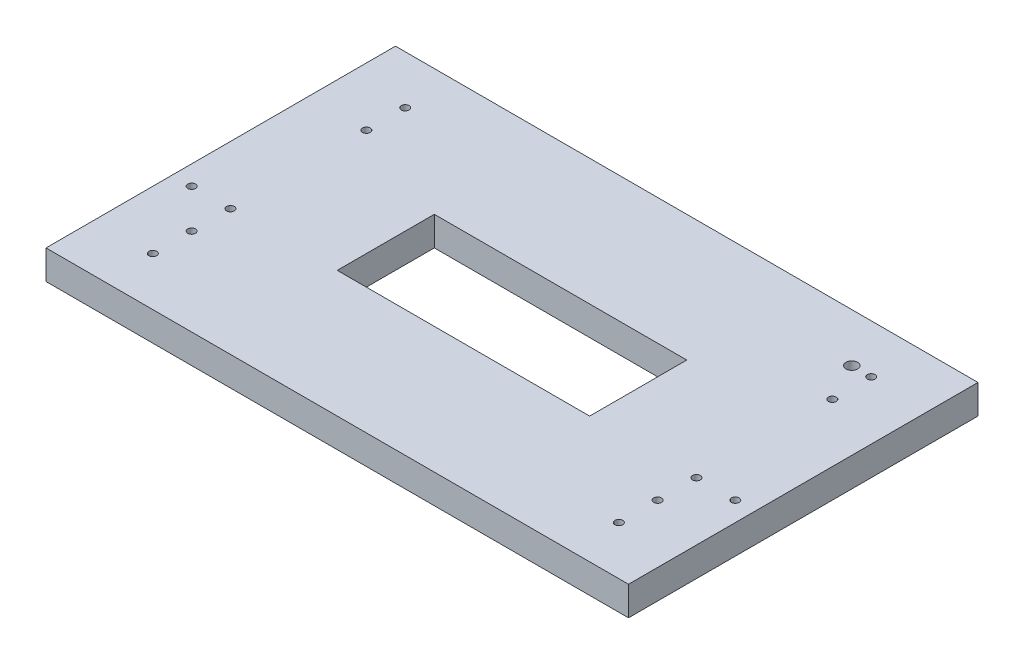
ISO-10303-21;
HEADER;
FILE_DESCRIPTION(('STEP AP214'),'2;1');
FILE_NAME('part.step','',(''),(''),'','','');
FILE_SCHEMA(('AUTOMOTIVE_DESIGN { 1 0 10303 214 1 1 1 1 }'));
ENDSEC;
DATA;
#1=APPLICATION_CONTEXT('core data for automotive mechanical design processes');
#2=APPLICATION_PROTOCOL_DEFINITION('international standard','automotive_design',2000,#1);
#3=PRODUCT_CONTEXT('',#1,'mechanical');
#4=PRODUCT('Part','Part','',(#3));
#5=PRODUCT_RELATED_PRODUCT_CATEGORY('part','',(#4));
#6=PRODUCT_DEFINITION_FORMATION('','',#4);
#7=PRODUCT_DEFINITION_CONTEXT('part definition',#1,'design');
#8=PRODUCT_DEFINITION('design','',#6,#7);
#9=PRODUCT_DEFINITION_SHAPE('','',#8);
#10=(LENGTH_UNIT() NAMED_UNIT(*) SI_UNIT(.MILLI.,.METRE.));
#11=(NAMED_UNIT(*) PLANE_ANGLE_UNIT() SI_UNIT($,.RADIAN.));
#12=(NAMED_UNIT(*) SI_UNIT($,.STERADIAN.) SOLID_ANGLE_UNIT());
#13=UNCERTAINTY_MEASURE_WITH_UNIT(LENGTH_MEASURE(1.E-05),#10,'distance_accuracy_value','');
#14=(GEOMETRIC_REPRESENTATION_CONTEXT(3) GLOBAL_UNCERTAINTY_ASSIGNED_CONTEXT((#13)) GLOBAL_UNIT_ASSIGNED_CONTEXT((#10,
#11,#12)) REPRESENTATION_CONTEXT('',''));
#15=CARTESIAN_POINT('',(0.,0.,0.));
#16=DIRECTION('',(0.,0.,1.));
#17=DIRECTION('',(1.,0.,0.));
#18=AXIS2_PLACEMENT_3D('',#15,#16,#17);
#19=CARTESIAN_POINT('',(150.,15.,90.));
#20=DIRECTION('',(-1.,0.,0.));
#21=DIRECTION('',(0.,0.,1.));
#22=AXIS2_PLACEMENT_3D('',#19,#20,#21);
#23=PLANE('',#22);
#24=DIRECTION('',(0.,0.,-1.));
#25=VECTOR('',#24,1.);
#26=CARTESIAN_POINT('',(150.,0.,90.));
#27=LINE('',#26,#25);
#28=CARTESIAN_POINT('',(150.,0.,90.));
#29=VERTEX_POINT('',#28);
#30=CARTESIAN_POINT('',(150.,0.,-90.));
#31=VERTEX_POINT('',#30);
#32=EDGE_CURVE('E204',#29,#31,#27,.T.);
#33=ORIENTED_EDGE('',*,*,#32,.T.);
#34=DIRECTION('',(0.,-1.,0.));
#35=VECTOR('',#34,1.);
#36=CARTESIAN_POINT('',(150.,15.,-90.));
#37=LINE('',#36,#35);
#38=CARTESIAN_POINT('',(150.,15.,-90.));
#39=VERTEX_POINT('',#38);
#40=EDGE_CURVE('E11',#39,#31,#37,.T.);
#41=ORIENTED_EDGE('',*,*,#40,.F.);
#42=DIRECTION('',(0.,0.,-1.));
#43=VECTOR('',#42,1.);
#44=CARTESIAN_POINT('',(150.,15.,90.));
#45=LINE('',#44,#43);
#46=CARTESIAN_POINT('',(150.,15.,90.));
#47=VERTEX_POINT('',#46);
#48=EDGE_CURVE('E207',#47,#39,#45,.T.);
#49=ORIENTED_EDGE('',*,*,#48,.F.);
#50=DIRECTION('',(0.,-1.,0.));
#51=VECTOR('',#50,1.);
#52=CARTESIAN_POINT('',(150.,15.,90.));
#53=LINE('',#52,#51);
#54=EDGE_CURVE('E217',#47,#29,#53,.T.);
#55=ORIENTED_EDGE('',*,*,#54,.T.);
#56=EDGE_LOOP('',(#33,#41,#49,#55));
#57=FACE_BOUND('',#56,.T.);
#58=ADVANCED_FACE('F33',(#57),#23,.F.);
#59=CARTESIAN_POINT('',(-150.,15.,-90.));
#60=DIRECTION('',(0.,0.,1.));
#61=DIRECTION('',(1.,0.,0.));
#62=AXIS2_PLACEMENT_3D('',#59,#60,#61);
#63=PLANE('',#62);
#64=DIRECTION('',(-1.,0.,0.));
#65=VECTOR('',#64,1.);
#66=CARTESIAN_POINT('',(-150.,0.,-90.));
#67=LINE('',#66,#65);
#68=CARTESIAN_POINT('',(-150.,0.,-90.));
#69=VERTEX_POINT('',#68);
#70=EDGE_CURVE('E220',#31,#69,#67,.T.);
#71=ORIENTED_EDGE('',*,*,#70,.T.);
#72=DIRECTION('',(0.,-1.,0.));
#73=VECTOR('',#72,1.);
#74=CARTESIAN_POINT('',(-150.,15.,-90.));
#75=LINE('',#74,#73);
#76=CARTESIAN_POINT('',(-150.,15.,-90.));
#77=VERTEX_POINT('',#76);
#78=EDGE_CURVE('E40',#77,#69,#75,.T.);
#79=ORIENTED_EDGE('',*,*,#78,.F.);
#80=DIRECTION('',(-1.,0.,0.));
#81=VECTOR('',#80,1.);
#82=CARTESIAN_POINT('',(-150.,15.,-90.));
#83=LINE('',#82,#81);
#84=EDGE_CURVE('E210',#39,#77,#83,.T.);
#85=ORIENTED_EDGE('',*,*,#84,.F.);
#86=ORIENTED_EDGE('',*,*,#40,.T.);
#87=EDGE_LOOP('',(#71,#79,#85,#86));
#88=FACE_BOUND('',#87,.T.);
#89=ADVANCED_FACE('F248',(#88),#63,.F.);
#90=CARTESIAN_POINT('',(-150.,15.,90.));
#91=DIRECTION('',(1.,0.,0.));
#92=DIRECTION('',(0.,0.,-1.));
#93=AXIS2_PLACEMENT_3D('',#90,#91,#92);
#94=PLANE('',#93);
#95=DIRECTION('',(0.,0.,1.));
#96=VECTOR('',#95,1.);
#97=CARTESIAN_POINT('',(-150.,0.,90.));
#98=LINE('',#97,#96);
#99=CARTESIAN_POINT('',(-150.,0.,90.));
#100=VERTEX_POINT('',#99);
#101=EDGE_CURVE('E222',#69,#100,#98,.T.);
#102=ORIENTED_EDGE('',*,*,#101,.T.);
#103=DIRECTION('',(0.,-1.,0.));
#104=VECTOR('',#103,1.);
#105=CARTESIAN_POINT('',(-150.,15.,90.));
#106=LINE('',#105,#104);
#107=CARTESIAN_POINT('',(-150.,15.,90.));
#108=VERTEX_POINT('',#107);
#109=EDGE_CURVE('E227',#108,#100,#106,.T.);
#110=ORIENTED_EDGE('',*,*,#109,.F.);
#111=DIRECTION('',(0.,0.,1.));
#112=VECTOR('',#111,1.);
#113=CARTESIAN_POINT('',(-150.,15.,90.));
#114=LINE('',#113,#112);
#115=EDGE_CURVE('E213',#77,#108,#114,.T.);
#116=ORIENTED_EDGE('',*,*,#115,.F.);
#117=ORIENTED_EDGE('',*,*,#78,.T.);
#118=EDGE_LOOP('',(#102,#110,#116,#117));
#119=FACE_BOUND('',#118,.T.);
#120=ADVANCED_FACE('F234',(#119),#94,.F.);
#121=CARTESIAN_POINT('',(-150.,15.,90.));
#122=DIRECTION('',(0.,0.,-1.));
#123=DIRECTION('',(-1.,0.,0.));
#124=AXIS2_PLACEMENT_3D('',#121,#122,#123);
#125=PLANE('',#124);
#126=DIRECTION('',(1.,0.,0.));
#127=VECTOR('',#126,1.);
#128=CARTESIAN_POINT('',(-150.,0.,90.));
#129=LINE('',#128,#127);
#130=EDGE_CURVE('E211',#100,#29,#129,.T.);
#131=ORIENTED_EDGE('',*,*,#130,.T.);
#132=ORIENTED_EDGE('',*,*,#54,.F.);
#133=DIRECTION('',(1.,0.,0.));
#134=VECTOR('',#133,1.);
#135=CARTESIAN_POINT('',(-150.,15.,90.));
#136=LINE('',#135,#134);
#137=EDGE_CURVE('E215',#108,#47,#136,.T.);
#138=ORIENTED_EDGE('',*,*,#137,.F.);
#139=ORIENTED_EDGE('',*,*,#109,.T.);
#140=EDGE_LOOP('',(#131,#132,#138,#139));
#141=FACE_BOUND('',#140,.T.);
#142=ADVANCED_FACE('F241',(#141),#125,.F.);
#143=CARTESIAN_POINT('',(0.,15.,0.));
#144=DIRECTION('',(0.,-1.,0.));
#145=DIRECTION('',(0.,0.,-1.));
#146=AXIS2_PLACEMENT_3D('',#143,#144,#145);
#147=PLANE('',#146);
#148=CARTESIAN_POINT('',(110.,15.,-65.));
#149=DIRECTION('',(0.,1.,0.));
#150=DIRECTION('',(0.,0.,1.));
#151=AXIS2_PLACEMENT_3D('',#148,#149,#150);
#152=CIRCLE('',#151,3.00000000000001);
#153=CARTESIAN_POINT('',(110.,15.,-62.));
#154=VERTEX_POINT('',#153);
#155=EDGE_CURVE('E386',#154,#154,#152,.T.);
#156=ORIENTED_EDGE('',*,*,#155,.F.);
#157=EDGE_LOOP('',(#156));
#158=FACE_BOUND('',#157,.T.);
#159=DIRECTION('',(0.,0.,1.));
#160=VECTOR('',#159,1.);
#161=CARTESIAN_POINT('',(-65.,15.,25.));
#162=LINE('',#161,#160);
#163=CARTESIAN_POINT('',(-65.,15.,-25.));
#164=VERTEX_POINT('',#163);
#165=CARTESIAN_POINT('',(-65.,15.,25.));
#166=VERTEX_POINT('',#165);
#167=EDGE_CURVE('E121',#164,#166,#162,.T.);
#168=ORIENTED_EDGE('',*,*,#167,.F.);
#169=DIRECTION('',(-1.,0.,0.));
#170=VECTOR('',#169,1.);
#171=CARTESIAN_POINT('',(-65.,15.,-25.));
#172=LINE('',#171,#170);
#173=CARTESIAN_POINT('',(65.,15.,-25.));
#174=VERTEX_POINT('',#173);
#175=EDGE_CURVE('E114',#174,#164,#172,.T.);
#176=ORIENTED_EDGE('',*,*,#175,.F.);
#177=DIRECTION('',(0.,0.,-1.));
#178=VECTOR('',#177,1.);
#179=CARTESIAN_POINT('',(65.,15.,25.));
#180=LINE('',#179,#178);
#181=CARTESIAN_POINT('',(65.,15.,25.));
#182=VERTEX_POINT('',#181);
#183=EDGE_CURVE('E125',#182,#174,#180,.T.);
#184=ORIENTED_EDGE('',*,*,#183,.F.);
#185=DIRECTION('',(1.,0.,0.));
#186=VECTOR('',#185,1.);
#187=CARTESIAN_POINT('',(-65.,15.,25.));
#188=LINE('',#187,#186);
#189=EDGE_CURVE('E47',#166,#182,#188,.T.);
#190=ORIENTED_EDGE('',*,*,#189,.F.);
#191=EDGE_LOOP('',(#168,#176,#184,#190));
#192=FACE_BOUND('',#191,.T.);
#193=CARTESIAN_POINT('',(120.,15.,-65.));
#194=DIRECTION('',(0.,1.,0.));
#195=DIRECTION('',(0.,0.,1.));
#196=AXIS2_PLACEMENT_3D('',#193,#194,#195);
#197=CIRCLE('',#196,2.);
#198=CARTESIAN_POINT('',(120.,15.,-63.));
#199=VERTEX_POINT('',#198);
#200=EDGE_CURVE('E134',#199,#199,#197,.T.);
#201=ORIENTED_EDGE('',*,*,#200,.F.);
#202=EDGE_LOOP('',(#201));
#203=FACE_BOUND('',#202,.T.);
#204=CARTESIAN_POINT('',(140.,15.,25.));
#205=DIRECTION('',(0.,1.,0.));
#206=DIRECTION('',(0.,0.,1.));
#207=AXIS2_PLACEMENT_3D('',#204,#205,#206);
#208=CIRCLE('',#207,2.);
#209=CARTESIAN_POINT('',(140.,15.,27.));
#210=VERTEX_POINT('',#209);
#211=EDGE_CURVE('E138',#210,#210,#208,.T.);
#212=ORIENTED_EDGE('',*,*,#211,.F.);
#213=EDGE_LOOP('',(#212));
#214=FACE_BOUND('',#213,.T.);
#215=CARTESIAN_POINT('',(120.,15.,25.));
#216=DIRECTION('',(0.,1.,0.));
#217=DIRECTION('',(0.,0.,1.));
#218=AXIS2_PLACEMENT_3D('',#215,#216,#217);
#219=CIRCLE('',#218,2.);
#220=CARTESIAN_POINT('',(120.,15.,27.));
#221=VERTEX_POINT('',#220);
#222=EDGE_CURVE('E144',#221,#221,#219,.T.);
#223=ORIENTED_EDGE('',*,*,#222,.F.);
#224=EDGE_LOOP('',(#223));
#225=FACE_BOUND('',#224,.T.);
#226=CARTESIAN_POINT('',(-120.,15.,25.));
#227=DIRECTION('',(0.,1.,0.));
#228=DIRECTION('',(0.,0.,1.));
#229=AXIS2_PLACEMENT_3D('',#226,#227,#228);
#230=CIRCLE('',#229,2.);
#231=CARTESIAN_POINT('',(-120.,15.,27.));
#232=VERTEX_POINT('',#231);
#233=EDGE_CURVE('E150',#232,#232,#230,.T.);
#234=ORIENTED_EDGE('',*,*,#233,.F.);
#235=EDGE_LOOP('',(#234));
#236=FACE_BOUND('',#235,.T.);
#237=CARTESIAN_POINT('',(-140.,15.,25.));
#238=DIRECTION('',(0.,1.,0.));
#239=DIRECTION('',(0.,0.,1.));
#240=AXIS2_PLACEMENT_3D('',#237,#238,#239);
#241=CIRCLE('',#240,2.);
#242=CARTESIAN_POINT('',(-140.,15.,27.));
#243=VERTEX_POINT('',#242);
#244=EDGE_CURVE('E156',#243,#243,#241,.T.);
#245=ORIENTED_EDGE('',*,*,#244,.F.);
#246=EDGE_LOOP('',(#245));
#247=FACE_BOUND('',#246,.T.);
#248=CARTESIAN_POINT('',(120.,15.,-45.));
#249=DIRECTION('',(0.,1.,0.));
#250=DIRECTION('',(0.,0.,1.));
#251=AXIS2_PLACEMENT_3D('',#248,#249,#250);
#252=CIRCLE('',#251,2.);
#253=CARTESIAN_POINT('',(120.,15.,-43.));
#254=VERTEX_POINT('',#253);
#255=EDGE_CURVE('E162',#254,#254,#252,.T.);
#256=ORIENTED_EDGE('',*,*,#255,.F.);
#257=EDGE_LOOP('',(#256));
#258=FACE_BOUND('',#257,.T.);
#259=CARTESIAN_POINT('',(-120.,15.,-45.));
#260=DIRECTION('',(0.,1.,0.));
#261=DIRECTION('',(0.,0.,1.));
#262=AXIS2_PLACEMENT_3D('',#259,#260,#261);
#263=CIRCLE('',#262,2.00000000000001);
#264=CARTESIAN_POINT('',(-120.,15.,-43.));
#265=VERTEX_POINT('',#264);
#266=EDGE_CURVE('E168',#265,#265,#263,.T.);
#267=ORIENTED_EDGE('',*,*,#266,.F.);
#268=EDGE_LOOP('',(#267));
#269=FACE_BOUND('',#268,.T.);
#270=CARTESIAN_POINT('',(-120.,15.,-65.));
#271=DIRECTION('',(0.,1.,0.));
#272=DIRECTION('',(0.,0.,1.));
#273=AXIS2_PLACEMENT_3D('',#270,#271,#272);
#274=CIRCLE('',#273,2.);
#275=CARTESIAN_POINT('',(-120.,15.,-63.));
#276=VERTEX_POINT('',#275);
#277=EDGE_CURVE('E174',#276,#276,#274,.T.);
#278=ORIENTED_EDGE('',*,*,#277,.F.);
#279=EDGE_LOOP('',(#278));
#280=FACE_BOUND('',#279,.T.);
#281=CARTESIAN_POINT('',(120.,15.,65.));
#282=DIRECTION('',(0.,1.,0.));
#283=DIRECTION('',(0.,0.,1.));
#284=AXIS2_PLACEMENT_3D('',#281,#282,#283);
#285=CIRCLE('',#284,2.);
#286=CARTESIAN_POINT('',(120.,15.,67.));
#287=VERTEX_POINT('',#286);
#288=EDGE_CURVE('E180',#287,#287,#285,.T.);
#289=ORIENTED_EDGE('',*,*,#288,.F.);
#290=EDGE_LOOP('',(#289));
#291=FACE_BOUND('',#290,.T.);
#292=CARTESIAN_POINT('',(120.,15.,45.));
#293=DIRECTION('',(0.,1.,0.));
#294=DIRECTION('',(0.,0.,1.));
#295=AXIS2_PLACEMENT_3D('',#292,#293,#294);
#296=CIRCLE('',#295,2.);
#297=CARTESIAN_POINT('',(120.,15.,47.));
#298=VERTEX_POINT('',#297);
#299=EDGE_CURVE('E186',#298,#298,#296,.T.);
#300=ORIENTED_EDGE('',*,*,#299,.F.);
#301=EDGE_LOOP('',(#300));
#302=FACE_BOUND('',#301,.T.);
#303=CARTESIAN_POINT('',(-120.,15.,65.));
#304=DIRECTION('',(0.,1.,0.));
#305=DIRECTION('',(0.,0.,1.));
#306=AXIS2_PLACEMENT_3D('',#303,#304,#305);
#307=CIRCLE('',#306,2.);
#308=CARTESIAN_POINT('',(-120.,15.,67.));
#309=VERTEX_POINT('',#308);
#310=EDGE_CURVE('E192',#309,#309,#307,.T.);
#311=ORIENTED_EDGE('',*,*,#310,.F.);
#312=EDGE_LOOP('',(#311));
#313=FACE_BOUND('',#312,.T.);
#314=CARTESIAN_POINT('',(-120.,15.,45.));
#315=DIRECTION('',(0.,1.,0.));
#316=DIRECTION('',(0.,0.,1.));
#317=AXIS2_PLACEMENT_3D('',#314,#315,#316);
#318=CIRCLE('',#317,2.);
#319=CARTESIAN_POINT('',(-120.,15.,47.));
#320=VERTEX_POINT('',#319);
#321=EDGE_CURVE('E198',#320,#320,#318,.T.);
#322=ORIENTED_EDGE('',*,*,#321,.F.);
#323=EDGE_LOOP('',(#322));
#324=FACE_BOUND('',#323,.T.);
#325=ORIENTED_EDGE('',*,*,#48,.T.);
#326=ORIENTED_EDGE('',*,*,#84,.T.);
#327=ORIENTED_EDGE('',*,*,#115,.T.);
#328=ORIENTED_EDGE('',*,*,#137,.T.);
#329=EDGE_LOOP('',(#325,#326,#327,#328));
#330=FACE_BOUND('',#329,.T.);
#331=ADVANCED_FACE('F247',(#158,#192,#203,#214,#225,#236,#247,#258,#269,#280,#291,#302,#313,
#324,#330),#147,.F.);
#332=CARTESIAN_POINT('',(0.,0.,0.));
#333=DIRECTION('',(0.,-1.,0.));
#334=DIRECTION('',(0.,0.,-1.));
#335=AXIS2_PLACEMENT_3D('',#332,#333,#334);
#336=PLANE('',#335);
#337=CARTESIAN_POINT('',(140.,0.,-65.));
#338=DIRECTION('',(0.,-1.,0.));
#339=DIRECTION('',(0.,0.,-1.));
#340=AXIS2_PLACEMENT_3D('',#337,#338,#339);
#341=CIRCLE('',#340,2.);
#342=CARTESIAN_POINT('',(140.,0.,-67.));
#343=VERTEX_POINT('',#342);
#344=EDGE_CURVE('E387',#343,#343,#341,.T.);
#345=ORIENTED_EDGE('',*,*,#344,.F.);
#346=EDGE_LOOP('',(#345));
#347=FACE_BOUND('',#346,.T.);
#348=CARTESIAN_POINT('',(110.,0.,-65.));
#349=DIRECTION('',(0.,-1.,0.));
#350=DIRECTION('',(0.,0.,-1.));
#351=AXIS2_PLACEMENT_3D('',#348,#349,#350);
#352=CIRCLE('',#351,3.00000000000001);
#353=CARTESIAN_POINT('',(110.,0.,-68.));
#354=VERTEX_POINT('',#353);
#355=EDGE_CURVE('E390',#354,#354,#352,.F.);
#356=ORIENTED_EDGE('',*,*,#355,.T.);
#357=EDGE_LOOP('',(#356));
#358=FACE_BOUND('',#357,.T.);
#359=DIRECTION('',(-1.,0.,0.));
#360=VECTOR('',#359,1.);
#361=CARTESIAN_POINT('',(-65.,0.,-25.));
#362=LINE('',#361,#360);
#363=CARTESIAN_POINT('',(65.,0.,-25.));
#364=VERTEX_POINT('',#363);
#365=CARTESIAN_POINT('',(-65.,0.,-25.));
#366=VERTEX_POINT('',#365);
#367=EDGE_CURVE('E111',#364,#366,#362,.T.);
#368=ORIENTED_EDGE('',*,*,#367,.T.);
#369=DIRECTION('',(0.,0.,1.));
#370=VECTOR('',#369,1.);
#371=CARTESIAN_POINT('',(-65.,0.,25.));
#372=LINE('',#371,#370);
#373=CARTESIAN_POINT('',(-65.,0.,25.));
#374=VERTEX_POINT('',#373);
#375=EDGE_CURVE('E98',#366,#374,#372,.T.);
#376=ORIENTED_EDGE('',*,*,#375,.T.);
#377=DIRECTION('',(1.,0.,0.));
#378=VECTOR('',#377,1.);
#379=CARTESIAN_POINT('',(-65.,0.,25.));
#380=LINE('',#379,#378);
#381=CARTESIAN_POINT('',(65.,0.,25.));
#382=VERTEX_POINT('',#381);
#383=EDGE_CURVE('E129',#374,#382,#380,.T.);
#384=ORIENTED_EDGE('',*,*,#383,.T.);
#385=DIRECTION('',(0.,0.,-1.));
#386=VECTOR('',#385,1.);
#387=CARTESIAN_POINT('',(65.,0.,25.));
#388=LINE('',#387,#386);
#389=EDGE_CURVE('E119',#382,#364,#388,.T.);
#390=ORIENTED_EDGE('',*,*,#389,.T.);
#391=EDGE_LOOP('',(#368,#376,#384,#390));
#392=FACE_BOUND('',#391,.T.);
#393=ORIENTED_EDGE('',*,*,#32,.F.);
#394=ORIENTED_EDGE('',*,*,#130,.F.);
#395=ORIENTED_EDGE('',*,*,#101,.F.);
#396=ORIENTED_EDGE('',*,*,#70,.F.);
#397=EDGE_LOOP('',(#393,#394,#395,#396));
#398=FACE_BOUND('',#397,.T.);
#399=ADVANCED_FACE('F117',(#347,#358,#392,#398),#336,.T.);
#400=CARTESIAN_POINT('',(-120.,5.,45.));
#401=DIRECTION('',(0.,1.,0.));
#402=DIRECTION('',(0.,0.,1.));
#403=AXIS2_PLACEMENT_3D('',#400,#401,#402);
#404=CYLINDRICAL_SURFACE('',#403,2.);
#405=CARTESIAN_POINT('',(-120.,5.,45.));
#406=DIRECTION('',(0.,1.,0.));
#407=DIRECTION('',(0.,0.,1.));
#408=AXIS2_PLACEMENT_3D('',#405,#406,#407);
#409=CIRCLE('',#408,2.);
#410=CARTESIAN_POINT('',(-120.,5.,47.));
#411=VERTEX_POINT('',#410);
#412=EDGE_CURVE('E201',#411,#411,#409,.T.);
#413=ORIENTED_EDGE('',*,*,#412,.F.);
#414=EDGE_LOOP('',(#413));
#415=FACE_BOUND('',#414,.T.);
#416=ORIENTED_EDGE('',*,*,#321,.T.);
#417=EDGE_LOOP('',(#416));
#418=FACE_BOUND('',#417,.T.);
#419=ADVANCED_FACE('F260',(#415,#418),#404,.F.);
#420=CARTESIAN_POINT('',(-120.,5.,45.));
#421=DIRECTION('',(0.,1.,0.));
#422=DIRECTION('',(0.,0.,1.));
#423=AXIS2_PLACEMENT_3D('',#420,#421,#422);
#424=PLANE('',#423);
#425=ORIENTED_EDGE('',*,*,#412,.T.);
#426=EDGE_LOOP('',(#425));
#427=FACE_BOUND('',#426,.T.);
#428=ADVANCED_FACE('F267',(#427),#424,.T.);
#429=CARTESIAN_POINT('',(-120.,5.,65.));
#430=DIRECTION('',(0.,1.,0.));
#431=DIRECTION('',(0.,0.,1.));
#432=AXIS2_PLACEMENT_3D('',#429,#430,#431);
#433=CYLINDRICAL_SURFACE('',#432,2.);
#434=CARTESIAN_POINT('',(-120.,5.,65.));
#435=DIRECTION('',(0.,1.,0.));
#436=DIRECTION('',(0.,0.,1.));
#437=AXIS2_PLACEMENT_3D('',#434,#435,#436);
#438=CIRCLE('',#437,2.);
#439=CARTESIAN_POINT('',(-120.,5.,67.));
#440=VERTEX_POINT('',#439);
#441=EDGE_CURVE('E195',#440,#440,#438,.T.);
#442=ORIENTED_EDGE('',*,*,#441,.F.);
#443=EDGE_LOOP('',(#442));
#444=FACE_BOUND('',#443,.T.);
#445=ORIENTED_EDGE('',*,*,#310,.T.);
#446=EDGE_LOOP('',(#445));
#447=FACE_BOUND('',#446,.T.);
#448=ADVANCED_FACE('F271',(#444,#447),#433,.F.);
#449=CARTESIAN_POINT('',(-120.,5.,65.));
#450=DIRECTION('',(0.,1.,0.));
#451=DIRECTION('',(0.,0.,1.));
#452=AXIS2_PLACEMENT_3D('',#449,#450,#451);
#453=PLANE('',#452);
#454=ORIENTED_EDGE('',*,*,#441,.T.);
#455=EDGE_LOOP('',(#454));
#456=FACE_BOUND('',#455,.T.);
#457=ADVANCED_FACE('F275',(#456),#453,.T.);
#458=CARTESIAN_POINT('',(120.,5.,45.));
#459=DIRECTION('',(0.,1.,0.));
#460=DIRECTION('',(0.,0.,1.));
#461=AXIS2_PLACEMENT_3D('',#458,#459,#460);
#462=CYLINDRICAL_SURFACE('',#461,2.);
#463=CARTESIAN_POINT('',(120.,5.,45.));
#464=DIRECTION('',(0.,1.,0.));
#465=DIRECTION('',(0.,0.,1.));
#466=AXIS2_PLACEMENT_3D('',#463,#464,#465);
#467=CIRCLE('',#466,2.);
#468=CARTESIAN_POINT('',(120.,5.,47.));
#469=VERTEX_POINT('',#468);
#470=EDGE_CURVE('E189',#469,#469,#467,.T.);
#471=ORIENTED_EDGE('',*,*,#470,.F.);
#472=EDGE_LOOP('',(#471));
#473=FACE_BOUND('',#472,.T.);
#474=ORIENTED_EDGE('',*,*,#299,.T.);
#475=EDGE_LOOP('',(#474));
#476=FACE_BOUND('',#475,.T.);
#477=ADVANCED_FACE('F279',(#473,#476),#462,.F.);
#478=CARTESIAN_POINT('',(120.,5.,45.));
#479=DIRECTION('',(0.,1.,0.));
#480=DIRECTION('',(0.,0.,1.));
#481=AXIS2_PLACEMENT_3D('',#478,#479,#480);
#482=PLANE('',#481);
#483=ORIENTED_EDGE('',*,*,#470,.T.);
#484=EDGE_LOOP('',(#483));
#485=FACE_BOUND('',#484,.T.);
#486=ADVANCED_FACE('F283',(#485),#482,.T.);
#487=CARTESIAN_POINT('',(120.,5.,65.));
#488=DIRECTION('',(0.,1.,0.));
#489=DIRECTION('',(0.,0.,1.));
#490=AXIS2_PLACEMENT_3D('',#487,#488,#489);
#491=CYLINDRICAL_SURFACE('',#490,2.);
#492=CARTESIAN_POINT('',(120.,5.,65.));
#493=DIRECTION('',(0.,1.,0.));
#494=DIRECTION('',(0.,0.,1.));
#495=AXIS2_PLACEMENT_3D('',#492,#493,#494);
#496=CIRCLE('',#495,2.);
#497=CARTESIAN_POINT('',(120.,5.,67.));
#498=VERTEX_POINT('',#497);
#499=EDGE_CURVE('E183',#498,#498,#496,.T.);
#500=ORIENTED_EDGE('',*,*,#499,.F.);
#501=EDGE_LOOP('',(#500));
#502=FACE_BOUND('',#501,.T.);
#503=ORIENTED_EDGE('',*,*,#288,.T.);
#504=EDGE_LOOP('',(#503));
#505=FACE_BOUND('',#504,.T.);
#506=ADVANCED_FACE('F287',(#502,#505),#491,.F.);
#507=CARTESIAN_POINT('',(120.,5.,65.));
#508=DIRECTION('',(0.,1.,0.));
#509=DIRECTION('',(0.,0.,1.));
#510=AXIS2_PLACEMENT_3D('',#507,#508,#509);
#511=PLANE('',#510);
#512=ORIENTED_EDGE('',*,*,#499,.T.);
#513=EDGE_LOOP('',(#512));
#514=FACE_BOUND('',#513,.T.);
#515=ADVANCED_FACE('F291',(#514),#511,.T.);
#516=CARTESIAN_POINT('',(-120.,5.,-65.));
#517=DIRECTION('',(0.,1.,0.));
#518=DIRECTION('',(0.,0.,1.));
#519=AXIS2_PLACEMENT_3D('',#516,#517,#518);
#520=CYLINDRICAL_SURFACE('',#519,2.);
#521=CARTESIAN_POINT('',(-120.,5.,-65.));
#522=DIRECTION('',(0.,1.,0.));
#523=DIRECTION('',(0.,0.,1.));
#524=AXIS2_PLACEMENT_3D('',#521,#522,#523);
#525=CIRCLE('',#524,2.);
#526=CARTESIAN_POINT('',(-120.,5.,-63.));
#527=VERTEX_POINT('',#526);
#528=EDGE_CURVE('E177',#527,#527,#525,.T.);
#529=ORIENTED_EDGE('',*,*,#528,.F.);
#530=EDGE_LOOP('',(#529));
#531=FACE_BOUND('',#530,.T.);
#532=ORIENTED_EDGE('',*,*,#277,.T.);
#533=EDGE_LOOP('',(#532));
#534=FACE_BOUND('',#533,.T.);
#535=ADVANCED_FACE('F295',(#531,#534),#520,.F.);
#536=CARTESIAN_POINT('',(-120.,5.,-65.));
#537=DIRECTION('',(0.,1.,0.));
#538=DIRECTION('',(0.,0.,1.));
#539=AXIS2_PLACEMENT_3D('',#536,#537,#538);
#540=PLANE('',#539);
#541=ORIENTED_EDGE('',*,*,#528,.T.);
#542=EDGE_LOOP('',(#541));
#543=FACE_BOUND('',#542,.T.);
#544=ADVANCED_FACE('F299',(#543),#540,.T.);
#545=CARTESIAN_POINT('',(-120.,5.,-45.));
#546=DIRECTION('',(0.,1.,0.));
#547=DIRECTION('',(0.,0.,1.));
#548=AXIS2_PLACEMENT_3D('',#545,#546,#547);
#549=CYLINDRICAL_SURFACE('',#548,2.00000000000001);
#550=CARTESIAN_POINT('',(-120.,5.,-45.));
#551=DIRECTION('',(0.,1.,0.));
#552=DIRECTION('',(0.,0.,1.));
#553=AXIS2_PLACEMENT_3D('',#550,#551,#552);
#554=CIRCLE('',#553,2.00000000000001);
#555=CARTESIAN_POINT('',(-120.,5.,-43.));
#556=VERTEX_POINT('',#555);
#557=EDGE_CURVE('E171',#556,#556,#554,.T.);
#558=ORIENTED_EDGE('',*,*,#557,.F.);
#559=EDGE_LOOP('',(#558));
#560=FACE_BOUND('',#559,.T.);
#561=ORIENTED_EDGE('',*,*,#266,.T.);
#562=EDGE_LOOP('',(#561));
#563=FACE_BOUND('',#562,.T.);
#564=ADVANCED_FACE('F303',(#560,#563),#549,.F.);
#565=CARTESIAN_POINT('',(-120.,5.,-45.));
#566=DIRECTION('',(0.,1.,0.));
#567=DIRECTION('',(0.,0.,1.));
#568=AXIS2_PLACEMENT_3D('',#565,#566,#567);
#569=PLANE('',#568);
#570=ORIENTED_EDGE('',*,*,#557,.T.);
#571=EDGE_LOOP('',(#570));
#572=FACE_BOUND('',#571,.T.);
#573=ADVANCED_FACE('F307',(#572),#569,.T.);
#574=CARTESIAN_POINT('',(120.,5.,-45.));
#575=DIRECTION('',(0.,1.,0.));
#576=DIRECTION('',(0.,0.,1.));
#577=AXIS2_PLACEMENT_3D('',#574,#575,#576);
#578=CYLINDRICAL_SURFACE('',#577,2.);
#579=CARTESIAN_POINT('',(120.,5.,-45.));
#580=DIRECTION('',(0.,1.,0.));
#581=DIRECTION('',(0.,0.,1.));
#582=AXIS2_PLACEMENT_3D('',#579,#580,#581);
#583=CIRCLE('',#582,2.);
#584=CARTESIAN_POINT('',(120.,5.,-43.));
#585=VERTEX_POINT('',#584);
#586=EDGE_CURVE('E165',#585,#585,#583,.T.);
#587=ORIENTED_EDGE('',*,*,#586,.F.);
#588=EDGE_LOOP('',(#587));
#589=FACE_BOUND('',#588,.T.);
#590=ORIENTED_EDGE('',*,*,#255,.T.);
#591=EDGE_LOOP('',(#590));
#592=FACE_BOUND('',#591,.T.);
#593=ADVANCED_FACE('F311',(#589,#592),#578,.F.);
#594=CARTESIAN_POINT('',(120.,5.,-45.));
#595=DIRECTION('',(0.,1.,0.));
#596=DIRECTION('',(0.,0.,1.));
#597=AXIS2_PLACEMENT_3D('',#594,#595,#596);
#598=PLANE('',#597);
#599=ORIENTED_EDGE('',*,*,#586,.T.);
#600=EDGE_LOOP('',(#599));
#601=FACE_BOUND('',#600,.T.);
#602=ADVANCED_FACE('F315',(#601),#598,.T.);
#603=CARTESIAN_POINT('',(-140.,5.,25.));
#604=DIRECTION('',(0.,1.,0.));
#605=DIRECTION('',(0.,0.,1.));
#606=AXIS2_PLACEMENT_3D('',#603,#604,#605);
#607=CYLINDRICAL_SURFACE('',#606,2.);
#608=CARTESIAN_POINT('',(-140.,5.,25.));
#609=DIRECTION('',(0.,1.,0.));
#610=DIRECTION('',(0.,0.,1.));
#611=AXIS2_PLACEMENT_3D('',#608,#609,#610);
#612=CIRCLE('',#611,2.);
#613=CARTESIAN_POINT('',(-140.,5.,27.));
#614=VERTEX_POINT('',#613);
#615=EDGE_CURVE('E159',#614,#614,#612,.T.);
#616=ORIENTED_EDGE('',*,*,#615,.F.);
#617=EDGE_LOOP('',(#616));
#618=FACE_BOUND('',#617,.T.);
#619=ORIENTED_EDGE('',*,*,#244,.T.);
#620=EDGE_LOOP('',(#619));
#621=FACE_BOUND('',#620,.T.);
#622=ADVANCED_FACE('F319',(#618,#621),#607,.F.);
#623=CARTESIAN_POINT('',(-140.,5.,25.));
#624=DIRECTION('',(0.,1.,0.));
#625=DIRECTION('',(0.,0.,1.));
#626=AXIS2_PLACEMENT_3D('',#623,#624,#625);
#627=PLANE('',#626);
#628=ORIENTED_EDGE('',*,*,#615,.T.);
#629=EDGE_LOOP('',(#628));
#630=FACE_BOUND('',#629,.T.);
#631=ADVANCED_FACE('F323',(#630),#627,.T.);
#632=CARTESIAN_POINT('',(-120.,5.,25.));
#633=DIRECTION('',(0.,1.,0.));
#634=DIRECTION('',(0.,0.,1.));
#635=AXIS2_PLACEMENT_3D('',#632,#633,#634);
#636=CYLINDRICAL_SURFACE('',#635,2.);
#637=CARTESIAN_POINT('',(-120.,5.,25.));
#638=DIRECTION('',(0.,1.,0.));
#639=DIRECTION('',(0.,0.,1.));
#640=AXIS2_PLACEMENT_3D('',#637,#638,#639);
#641=CIRCLE('',#640,2.);
#642=CARTESIAN_POINT('',(-120.,5.,27.));
#643=VERTEX_POINT('',#642);
#644=EDGE_CURVE('E153',#643,#643,#641,.T.);
#645=ORIENTED_EDGE('',*,*,#644,.F.);
#646=EDGE_LOOP('',(#645));
#647=FACE_BOUND('',#646,.T.);
#648=ORIENTED_EDGE('',*,*,#233,.T.);
#649=EDGE_LOOP('',(#648));
#650=FACE_BOUND('',#649,.T.);
#651=ADVANCED_FACE('F327',(#647,#650),#636,.F.);
#652=CARTESIAN_POINT('',(-120.,5.,25.));
#653=DIRECTION('',(0.,1.,0.));
#654=DIRECTION('',(0.,0.,1.));
#655=AXIS2_PLACEMENT_3D('',#652,#653,#654);
#656=PLANE('',#655);
#657=ORIENTED_EDGE('',*,*,#644,.T.);
#658=EDGE_LOOP('',(#657));
#659=FACE_BOUND('',#658,.T.);
#660=ADVANCED_FACE('F331',(#659),#656,.T.);
#661=CARTESIAN_POINT('',(120.,5.,25.));
#662=DIRECTION('',(0.,1.,0.));
#663=DIRECTION('',(0.,0.,1.));
#664=AXIS2_PLACEMENT_3D('',#661,#662,#663);
#665=CYLINDRICAL_SURFACE('',#664,2.);
#666=CARTESIAN_POINT('',(120.,5.,25.));
#667=DIRECTION('',(0.,1.,0.));
#668=DIRECTION('',(0.,0.,1.));
#669=AXIS2_PLACEMENT_3D('',#666,#667,#668);
#670=CIRCLE('',#669,2.);
#671=CARTESIAN_POINT('',(120.,5.,27.));
#672=VERTEX_POINT('',#671);
#673=EDGE_CURVE('E147',#672,#672,#670,.T.);
#674=ORIENTED_EDGE('',*,*,#673,.F.);
#675=EDGE_LOOP('',(#674));
#676=FACE_BOUND('',#675,.T.);
#677=ORIENTED_EDGE('',*,*,#222,.T.);
#678=EDGE_LOOP('',(#677));
#679=FACE_BOUND('',#678,.T.);
#680=ADVANCED_FACE('F335',(#676,#679),#665,.F.);
#681=CARTESIAN_POINT('',(120.,5.,25.));
#682=DIRECTION('',(0.,1.,0.));
#683=DIRECTION('',(0.,0.,1.));
#684=AXIS2_PLACEMENT_3D('',#681,#682,#683);
#685=PLANE('',#684);
#686=ORIENTED_EDGE('',*,*,#673,.T.);
#687=EDGE_LOOP('',(#686));
#688=FACE_BOUND('',#687,.T.);
#689=ADVANCED_FACE('F339',(#688),#685,.T.);
#690=CARTESIAN_POINT('',(140.,5.,25.));
#691=DIRECTION('',(0.,1.,0.));
#692=DIRECTION('',(0.,0.,1.));
#693=AXIS2_PLACEMENT_3D('',#690,#691,#692);
#694=CYLINDRICAL_SURFACE('',#693,2.);
#695=CARTESIAN_POINT('',(140.,5.,25.));
#696=DIRECTION('',(0.,1.,0.));
#697=DIRECTION('',(0.,0.,1.));
#698=AXIS2_PLACEMENT_3D('',#695,#696,#697);
#699=CIRCLE('',#698,2.);
#700=CARTESIAN_POINT('',(140.,5.,27.));
#701=VERTEX_POINT('',#700);
#702=EDGE_CURVE('E141',#701,#701,#699,.T.);
#703=ORIENTED_EDGE('',*,*,#702,.F.);
#704=EDGE_LOOP('',(#703));
#705=FACE_BOUND('',#704,.T.);
#706=ORIENTED_EDGE('',*,*,#211,.T.);
#707=EDGE_LOOP('',(#706));
#708=FACE_BOUND('',#707,.T.);
#709=ADVANCED_FACE('F343',(#705,#708),#694,.F.);
#710=CARTESIAN_POINT('',(140.,5.,25.));
#711=DIRECTION('',(0.,1.,0.));
#712=DIRECTION('',(0.,0.,1.));
#713=AXIS2_PLACEMENT_3D('',#710,#711,#712);
#714=PLANE('',#713);
#715=ORIENTED_EDGE('',*,*,#702,.T.);
#716=EDGE_LOOP('',(#715));
#717=FACE_BOUND('',#716,.T.);
#718=ADVANCED_FACE('F347',(#717),#714,.T.);
#719=CARTESIAN_POINT('',(120.,5.,-65.));
#720=DIRECTION('',(0.,1.,0.));
#721=DIRECTION('',(0.,0.,1.));
#722=AXIS2_PLACEMENT_3D('',#719,#720,#721);
#723=CYLINDRICAL_SURFACE('',#722,2.);
#724=CARTESIAN_POINT('',(120.,5.,-65.));
#725=DIRECTION('',(0.,1.,0.));
#726=DIRECTION('',(0.,0.,1.));
#727=AXIS2_PLACEMENT_3D('',#724,#725,#726);
#728=CIRCLE('',#727,2.);
#729=CARTESIAN_POINT('',(120.,5.,-63.));
#730=VERTEX_POINT('',#729);
#731=EDGE_CURVE('E135',#730,#730,#728,.T.);
#732=ORIENTED_EDGE('',*,*,#731,.F.);
#733=EDGE_LOOP('',(#732));
#734=FACE_BOUND('',#733,.T.);
#735=ORIENTED_EDGE('',*,*,#200,.T.);
#736=EDGE_LOOP('',(#735));
#737=FACE_BOUND('',#736,.T.);
#738=ADVANCED_FACE('F351',(#734,#737),#723,.F.);
#739=CARTESIAN_POINT('',(120.,5.,-65.));
#740=DIRECTION('',(0.,1.,0.));
#741=DIRECTION('',(0.,0.,1.));
#742=AXIS2_PLACEMENT_3D('',#739,#740,#741);
#743=PLANE('',#742);
#744=ORIENTED_EDGE('',*,*,#731,.T.);
#745=EDGE_LOOP('',(#744));
#746=FACE_BOUND('',#745,.T.);
#747=ADVANCED_FACE('F355',(#746),#743,.T.);
#748=CARTESIAN_POINT('',(-65.,-139.283882771841,-25.));
#749=DIRECTION('',(0.,0.,-1.));
#750=DIRECTION('',(-1.,0.,0.));
#751=AXIS2_PLACEMENT_3D('',#748,#749,#750);
#752=PLANE('',#751);
#753=DIRECTION('',(0.,1.,0.));
#754=VECTOR('',#753,1.);
#755=CARTESIAN_POINT('',(65.,-139.283882771841,-25.));
#756=LINE('',#755,#754);
#757=EDGE_CURVE('E55',#364,#174,#756,.T.);
#758=ORIENTED_EDGE('',*,*,#757,.T.);
#759=ORIENTED_EDGE('',*,*,#175,.T.);
#760=DIRECTION('',(0.,1.,0.));
#761=VECTOR('',#760,1.);
#762=CARTESIAN_POINT('',(-65.,-139.283882771841,-25.));
#763=LINE('',#762,#761);
#764=EDGE_CURVE('E102',#366,#164,#763,.T.);
#765=ORIENTED_EDGE('',*,*,#764,.F.);
#766=ORIENTED_EDGE('',*,*,#367,.F.);
#767=EDGE_LOOP('',(#758,#759,#765,#766));
#768=FACE_BOUND('',#767,.T.);
#769=ADVANCED_FACE('F110',(#768),#752,.F.);
#770=CARTESIAN_POINT('',(-65.,-139.283882771841,25.));
#771=DIRECTION('',(-1.,0.,0.));
#772=DIRECTION('',(0.,0.,1.));
#773=AXIS2_PLACEMENT_3D('',#770,#771,#772);
#774=PLANE('',#773);
#775=ORIENTED_EDGE('',*,*,#764,.T.);
#776=ORIENTED_EDGE('',*,*,#167,.T.);
#777=DIRECTION('',(0.,1.,0.));
#778=VECTOR('',#777,1.);
#779=CARTESIAN_POINT('',(-65.,-139.283882771841,25.));
#780=LINE('',#779,#778);
#781=EDGE_CURVE('E104',#374,#166,#780,.T.);
#782=ORIENTED_EDGE('',*,*,#781,.F.);
#783=ORIENTED_EDGE('',*,*,#375,.F.);
#784=EDGE_LOOP('',(#775,#776,#782,#783));
#785=FACE_BOUND('',#784,.T.);
#786=ADVANCED_FACE('F100',(#785),#774,.F.);
#787=CARTESIAN_POINT('',(-65.,-139.283882771841,25.));
#788=DIRECTION('',(0.,0.,1.));
#789=DIRECTION('',(1.,0.,0.));
#790=AXIS2_PLACEMENT_3D('',#787,#788,#789);
#791=PLANE('',#790);
#792=ORIENTED_EDGE('',*,*,#781,.T.);
#793=ORIENTED_EDGE('',*,*,#189,.T.);
#794=DIRECTION('',(0.,1.,0.));
#795=VECTOR('',#794,1.);
#796=CARTESIAN_POINT('',(65.,-139.283882771841,25.));
#797=LINE('',#796,#795);
#798=EDGE_CURVE('E128',#382,#182,#797,.T.);
#799=ORIENTED_EDGE('',*,*,#798,.F.);
#800=ORIENTED_EDGE('',*,*,#383,.F.);
#801=EDGE_LOOP('',(#792,#793,#799,#800));
#802=FACE_BOUND('',#801,.T.);
#803=ADVANCED_FACE('F364',(#802),#791,.F.);
#804=CARTESIAN_POINT('',(65.,-139.283882771841,25.));
#805=DIRECTION('',(1.,0.,0.));
#806=DIRECTION('',(0.,0.,-1.));
#807=AXIS2_PLACEMENT_3D('',#804,#805,#806);
#808=PLANE('',#807);
#809=ORIENTED_EDGE('',*,*,#798,.T.);
#810=ORIENTED_EDGE('',*,*,#183,.T.);
#811=ORIENTED_EDGE('',*,*,#757,.F.);
#812=ORIENTED_EDGE('',*,*,#389,.F.);
#813=EDGE_LOOP('',(#809,#810,#811,#812));
#814=FACE_BOUND('',#813,.T.);
#815=ADVANCED_FACE('F367',(#814),#808,.F.);
#816=CARTESIAN_POINT('',(110.,-139.283882771841,-65.));
#817=DIRECTION('',(0.,1.,0.));
#818=DIRECTION('',(0.,0.,1.));
#819=AXIS2_PLACEMENT_3D('',#816,#817,#818);
#820=CYLINDRICAL_SURFACE('',#819,3.00000000000001);
#821=ORIENTED_EDGE('',*,*,#155,.T.);
#822=EDGE_LOOP('',(#821));
#823=FACE_BOUND('',#822,.T.);
#824=ORIENTED_EDGE('',*,*,#355,.F.);
#825=EDGE_LOOP('',(#824));
#826=FACE_BOUND('',#825,.T.);
#827=ADVANCED_FACE('F370',(#823,#826),#820,.F.);
#828=CARTESIAN_POINT('',(140.,10.,-65.));
#829=DIRECTION('',(0.,-1.,0.));
#830=DIRECTION('',(0.,0.,-1.));
#831=AXIS2_PLACEMENT_3D('',#828,#829,#830);
#832=CYLINDRICAL_SURFACE('',#831,2.);
#833=CARTESIAN_POINT('',(140.,10.,-65.));
#834=DIRECTION('',(0.,-1.,0.));
#835=DIRECTION('',(0.,0.,-1.));
#836=AXIS2_PLACEMENT_3D('',#833,#834,#835);
#837=CIRCLE('',#836,2.);
#838=CARTESIAN_POINT('',(140.,10.,-67.));
#839=VERTEX_POINT('',#838);
#840=EDGE_CURVE('E385',#839,#839,#837,.T.);
#841=ORIENTED_EDGE('',*,*,#840,.F.);
#842=EDGE_LOOP('',(#841));
#843=FACE_BOUND('',#842,.T.);
#844=ORIENTED_EDGE('',*,*,#344,.T.);
#845=EDGE_LOOP('',(#844));
#846=FACE_BOUND('',#845,.T.);
#847=ADVANCED_FACE('F373',(#843,#846),#832,.F.);
#848=CARTESIAN_POINT('',(140.,10.,-65.));
#849=DIRECTION('',(0.,-1.,0.));
#850=DIRECTION('',(0.,0.,-1.));
#851=AXIS2_PLACEMENT_3D('',#848,#849,#850);
#852=PLANE('',#851);
#853=ORIENTED_EDGE('',*,*,#840,.T.);
#854=EDGE_LOOP('',(#853));
#855=FACE_BOUND('',#854,.T.);
#856=ADVANCED_FACE('F377',(#855),#852,.T.);
#857=CLOSED_SHELL('',(#58,#89,#120,#142,#331,#399,#419,#428,#448,#457,#477,#486,#506,#515,#535,
#544,#564,#573,#593,#602,#622,#631,#651,#660,#680,#689,#709,#718,#738,#747,#769,#786,#803,#815,
#827,#847,#856));
#858=MANIFOLD_SOLID_BREP('B2',#857);
#859=ADVANCED_BREP_SHAPE_REPRESENTATION('',(#18,#858),#14);
#860=SHAPE_DEFINITION_REPRESENTATION(#9,#859);
ENDSEC;
END-ISO-10303-21;
